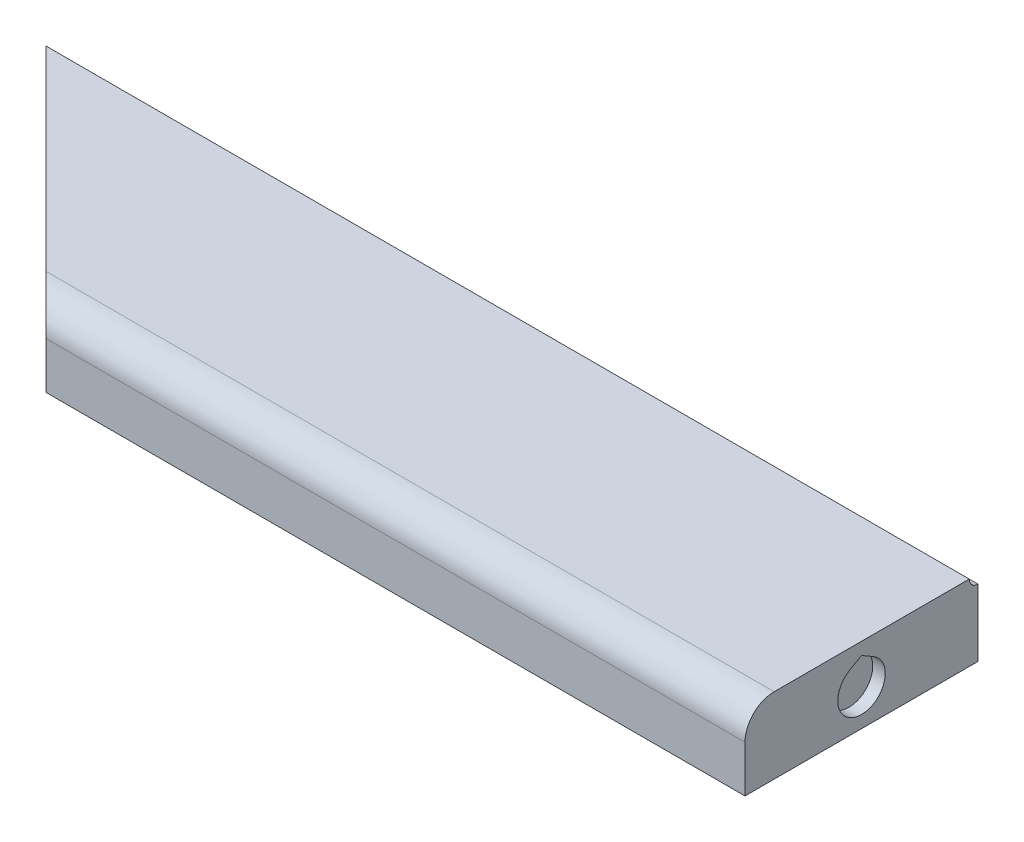
ISO-10303-21;
HEADER;
FILE_DESCRIPTION(('STEP AP214'),'2;1');
FILE_NAME('part.step','',(''),(''),'','','');
FILE_SCHEMA(('AUTOMOTIVE_DESIGN { 1 0 10303 214 1 1 1 1 }'));
ENDSEC;
DATA;
#1=APPLICATION_CONTEXT('core data for automotive mechanical design processes');
#2=APPLICATION_PROTOCOL_DEFINITION('international standard','automotive_design',2000,#1);
#3=PRODUCT_CONTEXT('',#1,'mechanical');
#4=PRODUCT('Part','Part','',(#3));
#5=PRODUCT_RELATED_PRODUCT_CATEGORY('part','',(#4));
#6=PRODUCT_DEFINITION_FORMATION('','',#4);
#7=PRODUCT_DEFINITION_CONTEXT('part definition',#1,'design');
#8=PRODUCT_DEFINITION('design','',#6,#7);
#9=PRODUCT_DEFINITION_SHAPE('','',#8);
#10=(LENGTH_UNIT() NAMED_UNIT(*) SI_UNIT(.MILLI.,.METRE.));
#11=(NAMED_UNIT(*) PLANE_ANGLE_UNIT() SI_UNIT($,.RADIAN.));
#12=(NAMED_UNIT(*) SI_UNIT($,.STERADIAN.) SOLID_ANGLE_UNIT());
#13=UNCERTAINTY_MEASURE_WITH_UNIT(LENGTH_MEASURE(1.E-05),#10,'distance_accuracy_value','');
#14=(GEOMETRIC_REPRESENTATION_CONTEXT(3) GLOBAL_UNCERTAINTY_ASSIGNED_CONTEXT((#13)) GLOBAL_UNIT_ASSIGNED_CONTEXT((#10,
#11,#12)) REPRESENTATION_CONTEXT('',''));
#15=CARTESIAN_POINT('',(0.,0.,0.));
#16=DIRECTION('',(0.,0.,1.));
#17=DIRECTION('',(1.,0.,0.));
#18=AXIS2_PLACEMENT_3D('',#15,#16,#17);
#19=CARTESIAN_POINT('',(80.,-13.,20.));
#20=DIRECTION('',(1.,0.,0.));
#21=DIRECTION('',(0.,0.,-1.));
#22=AXIS2_PLACEMENT_3D('',#19,#20,#21);
#23=PLANE('',#22);
#24=DIRECTION('',(0.,0.,-1.));
#25=VECTOR('',#24,1.);
#26=CARTESIAN_POINT('',(80.,0.,20.));
#27=LINE('',#26,#25);
#28=CARTESIAN_POINT('',(80.,0.,15.));
#29=VERTEX_POINT('',#28);
#30=CARTESIAN_POINT('',(80.,0.,-18.5));
#31=VERTEX_POINT('',#30);
#32=EDGE_CURVE('E232',#29,#31,#27,.T.);
#33=ORIENTED_EDGE('',*,*,#32,.F.);
#34=CARTESIAN_POINT('',(80.,-5.,15.));
#35=DIRECTION('',(1.,0.,0.));
#36=DIRECTION('',(0.,0.,-1.));
#37=AXIS2_PLACEMENT_3D('',#34,#35,#36);
#38=CIRCLE('',#37,5.);
#39=CARTESIAN_POINT('',(80.,-5.,20.));
#40=VERTEX_POINT('',#39);
#41=EDGE_CURVE('E260',#29,#40,#38,.T.);
#42=ORIENTED_EDGE('',*,*,#41,.T.);
#43=DIRECTION('',(0.,1.,0.));
#44=VECTOR('',#43,1.);
#45=CARTESIAN_POINT('',(80.,-13.,20.));
#46=LINE('',#45,#44);
#47=CARTESIAN_POINT('',(80.,-13.,20.));
#48=VERTEX_POINT('',#47);
#49=EDGE_CURVE('E252',#48,#40,#46,.T.);
#50=ORIENTED_EDGE('',*,*,#49,.F.);
#51=DIRECTION('',(0.,0.,-1.));
#52=VECTOR('',#51,1.);
#53=CARTESIAN_POINT('',(80.,-13.,20.));
#54=LINE('',#53,#52);
#55=CARTESIAN_POINT('',(80.,-13.,-20.));
#56=VERTEX_POINT('',#55);
#57=EDGE_CURVE('E235',#48,#56,#54,.T.);
#58=ORIENTED_EDGE('',*,*,#57,.T.);
#59=DIRECTION('',(0.,1.,0.));
#60=VECTOR('',#59,1.);
#61=CARTESIAN_POINT('',(80.,-13.,-20.));
#62=LINE('',#61,#60);
#63=CARTESIAN_POINT('',(80.,-1.5,-20.));
#64=VERTEX_POINT('',#63);
#65=EDGE_CURVE('E249',#56,#64,#62,.T.);
#66=ORIENTED_EDGE('',*,*,#65,.T.);
#67=CARTESIAN_POINT('',(80.,0.,-20.));
#68=DIRECTION('',(1.,0.,0.));
#69=DIRECTION('',(0.,0.,-1.));
#70=AXIS2_PLACEMENT_3D('',#67,#68,#69);
#71=CIRCLE('',#70,1.5);
#72=EDGE_CURVE('E193',#64,#31,#71,.F.);
#73=ORIENTED_EDGE('',*,*,#72,.T.);
#74=EDGE_LOOP('',(#33,#42,#50,#58,#66,#73));
#75=FACE_BOUND('',#74,.T.);
#76=DIRECTION('',(0.,-0.499999999999997,-0.866025403784441));
#77=VECTOR('',#76,1.);
#78=CARTESIAN_POINT('',(80.,-1.58234823978922,0.913569182193995));
#79=LINE('',#78,#77);
#80=CARTESIAN_POINT('',(80.,-2.10979765305228,0.));
#81=VERTEX_POINT('',#80);
#82=CARTESIAN_POINT('',(80.,-3.28614882652613,-2.03750000000002));
#83=VERTEX_POINT('',#82);
#84=EDGE_CURVE('E164',#81,#83,#79,.T.);
#85=ORIENTED_EDGE('',*,*,#84,.T.);
#86=CARTESIAN_POINT('',(80.,-6.81520234694772,0.));
#87=DIRECTION('',(1.,0.,0.));
#88=DIRECTION('',(0.,0.,-1.));
#89=AXIS2_PLACEMENT_3D('',#86,#87,#88);
#90=CIRCLE('',#89,4.075);
#91=CARTESIAN_POINT('',(80.,-3.28614882652612,2.03749999999996));
#92=VERTEX_POINT('',#91);
#93=EDGE_CURVE('E53',#83,#92,#90,.F.);
#94=ORIENTED_EDGE('',*,*,#93,.T.);
#95=DIRECTION('',(0.,-0.499999999999996,0.866025403784441));
#96=VECTOR('',#95,1.);
#97=CARTESIAN_POINT('',(80.,-1.58234823978922,-0.913569182194059));
#98=LINE('',#97,#96);
#99=EDGE_CURVE('E161',#81,#92,#98,.T.);
#100=ORIENTED_EDGE('',*,*,#99,.F.);
#101=EDGE_LOOP('',(#85,#94,#100));
#102=FACE_BOUND('',#101,.T.);
#103=ADVANCED_FACE('F38',(#75,#102),#23,.T.);
#104=CARTESIAN_POINT('',(-80.,-13.,-20.));
#105=DIRECTION('',(0.,0.,-1.));
#106=DIRECTION('',(-1.,0.,0.));
#107=AXIS2_PLACEMENT_3D('',#104,#105,#106);
#108=PLANE('',#107);
#109=CARTESIAN_POINT('',(40.,-7.56520234694772,-20.));
#110=DIRECTION('',(0.,0.,-1.));
#111=DIRECTION('',(-1.,0.,0.));
#112=AXIS2_PLACEMENT_3D('',#109,#110,#111);
#113=CIRCLE('',#112,4.075);
#114=CARTESIAN_POINT('',(42.0375,-4.03614882652612,-20.));
#115=VERTEX_POINT('',#114);
#116=CARTESIAN_POINT('',(37.9625,-4.03614882652615,-20.));
#117=VERTEX_POINT('',#116);
#118=EDGE_CURVE('E183',#115,#117,#113,.T.);
#119=ORIENTED_EDGE('',*,*,#118,.F.);
#120=DIRECTION('',(-0.866025403784441,0.499999999999996,0.));
#121=VECTOR('',#120,1.);
#122=CARTESIAN_POINT('',(8.76167129138664,15.1756598358994,-20.));
#123=LINE('',#122,#121);
#124=CARTESIAN_POINT('',(40.,-2.85979765305228,-20.));
#125=VERTEX_POINT('',#124);
#126=EDGE_CURVE('E178',#115,#125,#123,.T.);
#127=ORIENTED_EDGE('',*,*,#126,.T.);
#128=DIRECTION('',(-0.866025403784441,-0.499999999999996,0.));
#129=VECTOR('',#128,1.);
#130=CARTESIAN_POINT('',(11.238328708613,-19.4653563154779,-20.));
#131=LINE('',#130,#129);
#132=EDGE_CURVE('E185',#125,#117,#131,.T.);
#133=ORIENTED_EDGE('',*,*,#132,.T.);
#134=EDGE_LOOP('',(#119,#127,#133));
#135=FACE_BOUND('',#134,.T.);
#136=DIRECTION('',(-1.,0.,0.));
#137=VECTOR('',#136,1.);
#138=CARTESIAN_POINT('',(83.9999999999999,-1.5,-20.));
#139=LINE('',#138,#137);
#140=CARTESIAN_POINT('',(-80.,-1.5,-20.));
#141=VERTEX_POINT('',#140);
#142=EDGE_CURVE('E225',#64,#141,#139,.T.);
#143=ORIENTED_EDGE('',*,*,#142,.F.);
#144=ORIENTED_EDGE('',*,*,#65,.F.);
#145=DIRECTION('',(-1.,0.,0.));
#146=VECTOR('',#145,1.);
#147=CARTESIAN_POINT('',(-80.,-13.,-20.));
#148=LINE('',#147,#146);
#149=CARTESIAN_POINT('',(-80.,-13.,-20.));
#150=VERTEX_POINT('',#149);
#151=EDGE_CURVE('E238',#56,#150,#148,.T.);
#152=ORIENTED_EDGE('',*,*,#151,.T.);
#153=DIRECTION('',(0.,1.,0.));
#154=VECTOR('',#153,1.);
#155=CARTESIAN_POINT('',(-80.,-13.,-20.));
#156=LINE('',#155,#154);
#157=EDGE_CURVE('E245',#150,#141,#156,.T.);
#158=ORIENTED_EDGE('',*,*,#157,.T.);
#159=EDGE_LOOP('',(#143,#144,#152,#158));
#160=FACE_BOUND('',#159,.T.);
#161=DIRECTION('',(0.866025403784441,0.499999999999996,0.));
#162=VECTOR('',#161,1.);
#163=CARTESIAN_POINT('',(-8.76167129138664,15.1756598358995,-20.));
#164=LINE('',#163,#162);
#165=CARTESIAN_POINT('',(-42.0375,-4.03614882652612,-20.));
#166=VERTEX_POINT('',#165);
#167=CARTESIAN_POINT('',(-40.,-2.85979765305227,-20.));
#168=VERTEX_POINT('',#167);
#169=EDGE_CURVE('E210',#166,#168,#164,.T.);
#170=ORIENTED_EDGE('',*,*,#169,.F.);
#171=CARTESIAN_POINT('',(-40.,-7.56520234694772,-20.));
#172=DIRECTION('',(0.,0.,-1.));
#173=DIRECTION('',(-1.,0.,0.));
#174=AXIS2_PLACEMENT_3D('',#171,#172,#173);
#175=CIRCLE('',#174,4.075);
#176=CARTESIAN_POINT('',(-37.9625,-4.03614882652612,-20.));
#177=VERTEX_POINT('',#176);
#178=EDGE_CURVE('E172',#166,#177,#175,.F.);
#179=ORIENTED_EDGE('',*,*,#178,.T.);
#180=DIRECTION('',(0.866025403784441,-0.499999999999996,0.));
#181=VECTOR('',#180,1.);
#182=CARTESIAN_POINT('',(-11.238328708613,-19.4653563154779,-20.));
#183=LINE('',#182,#181);
#184=EDGE_CURVE('E201',#168,#177,#183,.T.);
#185=ORIENTED_EDGE('',*,*,#184,.F.);
#186=EDGE_LOOP('',(#170,#179,#185));
#187=FACE_BOUND('',#186,.T.);
#188=ADVANCED_FACE('F281',(#135,#160,#187),#108,.T.);
#189=CARTESIAN_POINT('',(-39.9999999999996,-13.,20.));
#190=DIRECTION('',(-0.707106781186544,0.,0.707106781186552));
#191=DIRECTION('',(0.707106781186551,0.,0.707106781186544));
#192=AXIS2_PLACEMENT_3D('',#189,#190,#191);
#193=PLANE('',#192);
#194=DIRECTION('',(0.,1.,0.));
#195=VECTOR('',#194,1.);
#196=CARTESIAN_POINT('',(-39.9999999999996,-13.,20.));
#197=LINE('',#196,#195);
#198=CARTESIAN_POINT('',(-39.9999999999996,-13.,20.));
#199=VERTEX_POINT('',#198);
#200=CARTESIAN_POINT('',(-39.9999999999996,-5.,20.));
#201=VERTEX_POINT('',#200);
#202=EDGE_CURVE('E241',#199,#201,#197,.T.);
#203=ORIENTED_EDGE('',*,*,#202,.T.);
#204=CARTESIAN_POINT('',(-44.9999999999996,-5.,15.));
#205=DIRECTION('',(-0.707106781186544,0.,0.707106781186552));
#206=DIRECTION('',(-0.707106781186551,0.,-0.707106781186544));
#207=AXIS2_PLACEMENT_3D('',#204,#205,#206);
#208=ELLIPSE('',#207,7.07106781186551,5.);
#209=CARTESIAN_POINT('',(-44.9999999999996,0.,15.));
#210=VERTEX_POINT('',#209);
#211=EDGE_CURVE('E11',#201,#210,#208,.T.);
#212=ORIENTED_EDGE('',*,*,#211,.T.);
#213=DIRECTION('',(0.707106781186551,0.,0.707106781186544));
#214=VECTOR('',#213,1.);
#215=CARTESIAN_POINT('',(-39.9999999999996,0.,20.));
#216=LINE('',#215,#214);
#217=CARTESIAN_POINT('',(-78.5,0.,-18.5));
#218=VERTEX_POINT('',#217);
#219=EDGE_CURVE('E227',#218,#210,#216,.T.);
#220=ORIENTED_EDGE('',*,*,#219,.F.);
#221=CARTESIAN_POINT('',(-80.,0.,-20.));
#222=DIRECTION('',(-0.707106781186544,0.,0.707106781186552));
#223=DIRECTION('',(-0.707106781186551,0.,-0.707106781186544));
#224=AXIS2_PLACEMENT_3D('',#221,#222,#223);
#225=ELLIPSE('',#224,2.12132034355966,1.5);
#226=EDGE_CURVE('E222',#218,#141,#225,.F.);
#227=ORIENTED_EDGE('',*,*,#226,.T.);
#228=ORIENTED_EDGE('',*,*,#157,.F.);
#229=DIRECTION('',(0.707106781186551,0.,0.707106781186544));
#230=VECTOR('',#229,1.);
#231=CARTESIAN_POINT('',(-39.9999999999996,-13.,20.));
#232=LINE('',#231,#230);
#233=EDGE_CURVE('E228',#150,#199,#232,.T.);
#234=ORIENTED_EDGE('',*,*,#233,.T.);
#235=EDGE_LOOP('',(#203,#212,#220,#227,#228,#234));
#236=FACE_BOUND('',#235,.T.);
#237=ADVANCED_FACE('F272',(#236),#193,.T.);
#238=CARTESIAN_POINT('',(-39.9999999999996,-13.,20.));
#239=DIRECTION('',(0.,0.,1.));
#240=DIRECTION('',(1.,0.,0.));
#241=AXIS2_PLACEMENT_3D('',#238,#239,#240);
#242=PLANE('',#241);
#243=ORIENTED_EDGE('',*,*,#49,.T.);
#244=DIRECTION('',(1.,0.,0.));
#245=VECTOR('',#244,1.);
#246=CARTESIAN_POINT('',(-39.9999999999996,-5.,20.));
#247=LINE('',#246,#245);
#248=EDGE_CURVE('E46',#40,#201,#247,.F.);
#249=ORIENTED_EDGE('',*,*,#248,.T.);
#250=ORIENTED_EDGE('',*,*,#202,.F.);
#251=DIRECTION('',(1.,0.,0.));
#252=VECTOR('',#251,1.);
#253=CARTESIAN_POINT('',(-39.9999999999996,-13.,20.));
#254=LINE('',#253,#252);
#255=EDGE_CURVE('E231',#199,#48,#254,.T.);
#256=ORIENTED_EDGE('',*,*,#255,.T.);
#257=EDGE_LOOP('',(#243,#249,#250,#256));
#258=FACE_BOUND('',#257,.T.);
#259=ADVANCED_FACE('F267',(#258),#242,.T.);
#260=CARTESIAN_POINT('',(0.,-13.,0.));
#261=DIRECTION('',(0.,-1.,0.));
#262=DIRECTION('',(0.,0.,-1.));
#263=AXIS2_PLACEMENT_3D('',#260,#261,#262);
#264=PLANE('',#263);
#265=ORIENTED_EDGE('',*,*,#233,.F.);
#266=ORIENTED_EDGE('',*,*,#151,.F.);
#267=ORIENTED_EDGE('',*,*,#57,.F.);
#268=ORIENTED_EDGE('',*,*,#255,.F.);
#269=EDGE_LOOP('',(#265,#266,#267,#268));
#270=FACE_BOUND('',#269,.T.);
#271=ADVANCED_FACE('F285',(#270),#264,.T.);
#272=CARTESIAN_POINT('',(0.,0.,0.));
#273=DIRECTION('',(0.,-1.,0.));
#274=DIRECTION('',(0.,0.,-1.));
#275=AXIS2_PLACEMENT_3D('',#272,#273,#274);
#276=PLANE('',#275);
#277=ORIENTED_EDGE('',*,*,#219,.T.);
#278=DIRECTION('',(1.,0.,0.));
#279=VECTOR('',#278,1.);
#280=CARTESIAN_POINT('',(80.,0.,15.));
#281=LINE('',#280,#279);
#282=EDGE_CURVE('E257',#210,#29,#281,.T.);
#283=ORIENTED_EDGE('',*,*,#282,.T.);
#284=ORIENTED_EDGE('',*,*,#32,.T.);
#285=DIRECTION('',(-1.,0.,0.));
#286=VECTOR('',#285,1.);
#287=CARTESIAN_POINT('',(83.9999999999999,0.,-18.5));
#288=LINE('',#287,#286);
#289=EDGE_CURVE('E248',#31,#218,#288,.T.);
#290=ORIENTED_EDGE('',*,*,#289,.T.);
#291=EDGE_LOOP('',(#277,#283,#284,#290));
#292=FACE_BOUND('',#291,.T.);
#293=ADVANCED_FACE('F274',(#292),#276,.F.);
#294=CARTESIAN_POINT('',(83.9999999999999,0.,-20.));
#295=DIRECTION('',(-1.,0.,0.));
#296=DIRECTION('',(0.,0.,1.));
#297=AXIS2_PLACEMENT_3D('',#294,#295,#296);
#298=CYLINDRICAL_SURFACE('',#297,1.5);
#299=ORIENTED_EDGE('',*,*,#142,.T.);
#300=ORIENTED_EDGE('',*,*,#226,.F.);
#301=ORIENTED_EDGE('',*,*,#289,.F.);
#302=ORIENTED_EDGE('',*,*,#72,.F.);
#303=EDGE_LOOP('',(#299,#300,#301,#302));
#304=FACE_BOUND('',#303,.T.);
#305=ADVANCED_FACE('F277',(#304),#298,.F.);
#306=CARTESIAN_POINT('',(-40.,-7.56520234694772,-17.85));
#307=DIRECTION('',(0.,0.,-1.));
#308=DIRECTION('',(-1.,0.,0.));
#309=AXIS2_PLACEMENT_3D('',#306,#307,#308);
#310=CYLINDRICAL_SURFACE('',#309,4.075);
#311=ORIENTED_EDGE('',*,*,#178,.F.);
#312=DIRECTION('',(0.,0.,-1.));
#313=VECTOR('',#312,1.);
#314=CARTESIAN_POINT('',(-42.0375,-4.03614882652611,-17.85));
#315=LINE('',#314,#313);
#316=CARTESIAN_POINT('',(-42.0375,-4.03614882652611,-17.85));
#317=VERTEX_POINT('',#316);
#318=EDGE_CURVE('E207',#317,#166,#315,.T.);
#319=ORIENTED_EDGE('',*,*,#318,.F.);
#320=CARTESIAN_POINT('',(-40.,-7.56520234694772,-17.85));
#321=DIRECTION('',(0.,0.,-1.));
#322=DIRECTION('',(-1.,0.,0.));
#323=AXIS2_PLACEMENT_3D('',#320,#321,#322);
#324=CIRCLE('',#323,4.075);
#325=CARTESIAN_POINT('',(-37.9625,-4.03614882652612,-17.85));
#326=VERTEX_POINT('',#325);
#327=EDGE_CURVE('E198',#317,#326,#324,.F.);
#328=ORIENTED_EDGE('',*,*,#327,.T.);
#329=DIRECTION('',(0.,0.,-1.));
#330=VECTOR('',#329,1.);
#331=CARTESIAN_POINT('',(-37.9625,-4.03614882652612,-17.85));
#332=LINE('',#331,#330);
#333=EDGE_CURVE('E186',#326,#177,#332,.T.);
#334=ORIENTED_EDGE('',*,*,#333,.T.);
#335=EDGE_LOOP('',(#311,#319,#328,#334));
#336=FACE_BOUND('',#335,.T.);
#337=ADVANCED_FACE('F453',(#336),#310,.F.);
#338=CARTESIAN_POINT('',(-11.238328708613,-19.4653563154779,-17.85));
#339=DIRECTION('',(0.499999999999996,0.86602540378444,0.));
#340=DIRECTION('',(-0.866025403784441,0.499999999999997,0.));
#341=AXIS2_PLACEMENT_3D('',#338,#339,#340);
#342=PLANE('',#341);
#343=ORIENTED_EDGE('',*,*,#184,.T.);
#344=ORIENTED_EDGE('',*,*,#333,.F.);
#345=DIRECTION('',(0.866025403784441,-0.499999999999996,0.));
#346=VECTOR('',#345,1.);
#347=CARTESIAN_POINT('',(-11.238328708613,-19.4653563154779,-17.85));
#348=LINE('',#347,#346);
#349=CARTESIAN_POINT('',(-40.,-2.85979765305227,-17.85));
#350=VERTEX_POINT('',#349);
#351=EDGE_CURVE('E204',#350,#326,#348,.T.);
#352=ORIENTED_EDGE('',*,*,#351,.F.);
#353=DIRECTION('',(0.,0.,-1.));
#354=VECTOR('',#353,1.);
#355=CARTESIAN_POINT('',(-40.,-2.85979765305227,-17.85));
#356=LINE('',#355,#354);
#357=EDGE_CURVE('E216',#350,#168,#356,.T.);
#358=ORIENTED_EDGE('',*,*,#357,.T.);
#359=EDGE_LOOP('',(#343,#344,#352,#358));
#360=FACE_BOUND('',#359,.T.);
#361=ADVANCED_FACE('F443',(#360),#342,.F.);
#362=CARTESIAN_POINT('',(-8.76167129138664,15.1756598358995,-17.85));
#363=DIRECTION('',(-0.499999999999996,0.866025403784441,0.));
#364=DIRECTION('',(-0.866025403784441,-0.499999999999996,0.));
#365=AXIS2_PLACEMENT_3D('',#362,#363,#364);
#366=PLANE('',#365);
#367=ORIENTED_EDGE('',*,*,#169,.T.);
#368=ORIENTED_EDGE('',*,*,#357,.F.);
#369=DIRECTION('',(0.866025403784441,0.499999999999996,0.));
#370=VECTOR('',#369,1.);
#371=CARTESIAN_POINT('',(-8.76167129138664,15.1756598358995,-17.85));
#372=LINE('',#371,#370);
#373=EDGE_CURVE('E200',#317,#350,#372,.T.);
#374=ORIENTED_EDGE('',*,*,#373,.F.);
#375=ORIENTED_EDGE('',*,*,#318,.T.);
#376=EDGE_LOOP('',(#367,#368,#374,#375));
#377=FACE_BOUND('',#376,.T.);
#378=ADVANCED_FACE('F434',(#377),#366,.F.);
#379=CARTESIAN_POINT('',(0.,0.,-17.85));
#380=DIRECTION('',(0.,0.,-1.));
#381=DIRECTION('',(-1.,0.,0.));
#382=AXIS2_PLACEMENT_3D('',#379,#380,#381);
#383=PLANE('',#382);
#384=ORIENTED_EDGE('',*,*,#327,.F.);
#385=ORIENTED_EDGE('',*,*,#373,.T.);
#386=ORIENTED_EDGE('',*,*,#351,.T.);
#387=EDGE_LOOP('',(#384,#385,#386));
#388=FACE_BOUND('',#387,.T.);
#389=ADVANCED_FACE('F423',(#388),#383,.T.);
#390=CARTESIAN_POINT('',(40.,-7.56520234694772,-17.85));
#391=DIRECTION('',(0.,0.,-1.));
#392=DIRECTION('',(-1.,0.,0.));
#393=AXIS2_PLACEMENT_3D('',#390,#391,#392);
#394=CYLINDRICAL_SURFACE('',#393,4.075);
#395=ORIENTED_EDGE('',*,*,#118,.T.);
#396=DIRECTION('',(0.,0.,-1.));
#397=VECTOR('',#396,1.);
#398=CARTESIAN_POINT('',(37.9625,-4.03614882652613,-17.85));
#399=LINE('',#398,#397);
#400=CARTESIAN_POINT('',(37.9625,-4.03614882652613,-17.85));
#401=VERTEX_POINT('',#400);
#402=EDGE_CURVE('E182',#401,#117,#399,.T.);
#403=ORIENTED_EDGE('',*,*,#402,.F.);
#404=CARTESIAN_POINT('',(40.,-7.56520234694772,-17.85));
#405=DIRECTION('',(0.,0.,-1.));
#406=DIRECTION('',(-1.,0.,0.));
#407=AXIS2_PLACEMENT_3D('',#404,#405,#406);
#408=CIRCLE('',#407,4.075);
#409=CARTESIAN_POINT('',(42.0375,-4.03614882652612,-17.85));
#410=VERTEX_POINT('',#409);
#411=EDGE_CURVE('E174',#410,#401,#408,.T.);
#412=ORIENTED_EDGE('',*,*,#411,.F.);
#413=DIRECTION('',(0.,0.,-1.));
#414=VECTOR('',#413,1.);
#415=CARTESIAN_POINT('',(42.0375,-4.03614882652612,-17.85));
#416=LINE('',#415,#414);
#417=EDGE_CURVE('E191',#410,#115,#416,.T.);
#418=ORIENTED_EDGE('',*,*,#417,.T.);
#419=EDGE_LOOP('',(#395,#403,#412,#418));
#420=FACE_BOUND('',#419,.T.);
#421=ADVANCED_FACE('F413',(#420),#394,.F.);
#422=CARTESIAN_POINT('',(8.76167129138664,15.1756598358994,-17.85));
#423=DIRECTION('',(-0.499999999999996,-0.866025403784441,0.));
#424=DIRECTION('',(0.866025403784441,-0.499999999999996,0.));
#425=AXIS2_PLACEMENT_3D('',#422,#423,#424);
#426=PLANE('',#425);
#427=ORIENTED_EDGE('',*,*,#126,.F.);
#428=ORIENTED_EDGE('',*,*,#417,.F.);
#429=DIRECTION('',(-0.866025403784441,0.499999999999996,0.));
#430=VECTOR('',#429,1.);
#431=CARTESIAN_POINT('',(8.76167129138664,15.1756598358994,-17.85));
#432=LINE('',#431,#430);
#433=CARTESIAN_POINT('',(40.,-2.85979765305228,-17.85));
#434=VERTEX_POINT('',#433);
#435=EDGE_CURVE('E180',#410,#434,#432,.T.);
#436=ORIENTED_EDGE('',*,*,#435,.T.);
#437=DIRECTION('',(0.,0.,-1.));
#438=VECTOR('',#437,1.);
#439=CARTESIAN_POINT('',(40.,-2.85979765305228,-17.85));
#440=LINE('',#439,#438);
#441=EDGE_CURVE('E194',#434,#125,#440,.T.);
#442=ORIENTED_EDGE('',*,*,#441,.T.);
#443=EDGE_LOOP('',(#427,#428,#436,#442));
#444=FACE_BOUND('',#443,.T.);
#445=ADVANCED_FACE('F403',(#444),#426,.T.);
#446=CARTESIAN_POINT('',(11.238328708613,-19.4653563154779,-17.85));
#447=DIRECTION('',(0.499999999999996,-0.86602540378444,0.));
#448=DIRECTION('',(0.866025403784441,0.499999999999997,0.));
#449=AXIS2_PLACEMENT_3D('',#446,#447,#448);
#450=PLANE('',#449);
#451=ORIENTED_EDGE('',*,*,#132,.F.);
#452=ORIENTED_EDGE('',*,*,#441,.F.);
#453=DIRECTION('',(-0.866025403784441,-0.499999999999996,0.));
#454=VECTOR('',#453,1.);
#455=CARTESIAN_POINT('',(11.238328708613,-19.4653563154779,-17.85));
#456=LINE('',#455,#454);
#457=EDGE_CURVE('E177',#434,#401,#456,.T.);
#458=ORIENTED_EDGE('',*,*,#457,.T.);
#459=ORIENTED_EDGE('',*,*,#402,.T.);
#460=EDGE_LOOP('',(#451,#452,#458,#459));
#461=FACE_BOUND('',#460,.T.);
#462=ADVANCED_FACE('F394',(#461),#450,.T.);
#463=CARTESIAN_POINT('',(0.,0.,-17.85));
#464=DIRECTION('',(0.,0.,-1.));
#465=DIRECTION('',(-1.,0.,0.));
#466=AXIS2_PLACEMENT_3D('',#463,#464,#465);
#467=PLANE('',#466);
#468=ORIENTED_EDGE('',*,*,#411,.T.);
#469=ORIENTED_EDGE('',*,*,#457,.F.);
#470=ORIENTED_EDGE('',*,*,#435,.F.);
#471=EDGE_LOOP('',(#468,#469,#470));
#472=FACE_BOUND('',#471,.T.);
#473=ADVANCED_FACE('F331',(#472),#467,.T.);
#474=CARTESIAN_POINT('',(0.,-5.,15.));
#475=DIRECTION('',(-1.,0.,0.));
#476=DIRECTION('',(0.,0.,1.));
#477=AXIS2_PLACEMENT_3D('',#474,#475,#476);
#478=CYLINDRICAL_SURFACE('',#477,5.);
#479=ORIENTED_EDGE('',*,*,#211,.F.);
#480=ORIENTED_EDGE('',*,*,#248,.F.);
#481=ORIENTED_EDGE('',*,*,#41,.F.);
#482=ORIENTED_EDGE('',*,*,#282,.F.);
#483=EDGE_LOOP('',(#479,#480,#481,#482));
#484=FACE_BOUND('',#483,.T.);
#485=ADVANCED_FACE('F40',(#484),#478,.T.);
#486=CARTESIAN_POINT('',(77.85,-6.81520234694772,0.));
#487=DIRECTION('',(1.,0.,0.));
#488=DIRECTION('',(0.,0.,-1.));
#489=AXIS2_PLACEMENT_3D('',#486,#487,#488);
#490=CYLINDRICAL_SURFACE('',#489,4.075);
#491=ORIENTED_EDGE('',*,*,#93,.F.);
#492=DIRECTION('',(1.,0.,0.));
#493=VECTOR('',#492,1.);
#494=CARTESIAN_POINT('',(77.85,-3.28614882652613,-2.03750000000002));
#495=LINE('',#494,#493);
#496=CARTESIAN_POINT('',(77.85,-3.28614882652613,-2.03750000000002));
#497=VERTEX_POINT('',#496);
#498=EDGE_CURVE('E147',#497,#83,#495,.T.);
#499=ORIENTED_EDGE('',*,*,#498,.F.);
#500=CARTESIAN_POINT('',(77.85,-6.81520234694772,0.));
#501=DIRECTION('',(1.,0.,0.));
#502=DIRECTION('',(0.,0.,-1.));
#503=AXIS2_PLACEMENT_3D('',#500,#501,#502);
#504=CIRCLE('',#503,4.075);
#505=CARTESIAN_POINT('',(77.85,-3.28614882652612,2.03749999999996));
#506=VERTEX_POINT('',#505);
#507=EDGE_CURVE('E155',#497,#506,#504,.F.);
#508=ORIENTED_EDGE('',*,*,#507,.T.);
#509=DIRECTION('',(1.,0.,0.));
#510=VECTOR('',#509,1.);
#511=CARTESIAN_POINT('',(77.85,-3.28614882652612,2.03749999999996));
#512=LINE('',#511,#510);
#513=EDGE_CURVE('E170',#506,#92,#512,.T.);
#514=ORIENTED_EDGE('',*,*,#513,.T.);
#515=EDGE_LOOP('',(#491,#499,#508,#514));
#516=FACE_BOUND('',#515,.T.);
#517=ADVANCED_FACE('F157',(#516),#490,.F.);
#518=CARTESIAN_POINT('',(77.85,-1.58234823978922,-0.913569182194059));
#519=DIRECTION('',(0.,0.866025403784441,0.499999999999996));
#520=DIRECTION('',(0.,-0.499999999999996,0.866025403784441));
#521=AXIS2_PLACEMENT_3D('',#518,#519,#520);
#522=PLANE('',#521);
#523=ORIENTED_EDGE('',*,*,#99,.T.);
#524=ORIENTED_EDGE('',*,*,#513,.F.);
#525=DIRECTION('',(0.,-0.499999999999996,0.866025403784441));
#526=VECTOR('',#525,1.);
#527=CARTESIAN_POINT('',(77.85,-1.58234823978922,-0.913569182194059));
#528=LINE('',#527,#526);
#529=CARTESIAN_POINT('',(77.85,-2.10979765305228,0.));
#530=VERTEX_POINT('',#529);
#531=EDGE_CURVE('E154',#530,#506,#528,.T.);
#532=ORIENTED_EDGE('',*,*,#531,.F.);
#533=DIRECTION('',(1.,0.,0.));
#534=VECTOR('',#533,1.);
#535=CARTESIAN_POINT('',(77.85,-2.10979765305228,0.));
#536=LINE('',#535,#534);
#537=EDGE_CURVE('E149',#530,#81,#536,.T.);
#538=ORIENTED_EDGE('',*,*,#537,.T.);
#539=EDGE_LOOP('',(#523,#524,#532,#538));
#540=FACE_BOUND('',#539,.T.);
#541=ADVANCED_FACE('F348',(#540),#522,.F.);
#542=CARTESIAN_POINT('',(77.85,-1.58234823978922,0.913569182193995));
#543=DIRECTION('',(0.,-0.86602540378444,0.499999999999997));
#544=DIRECTION('',(0.,-0.499999999999997,-0.86602540378444));
#545=AXIS2_PLACEMENT_3D('',#542,#543,#544);
#546=PLANE('',#545);
#547=ORIENTED_EDGE('',*,*,#84,.F.);
#548=ORIENTED_EDGE('',*,*,#537,.F.);
#549=DIRECTION('',(0.,-0.499999999999997,-0.866025403784441));
#550=VECTOR('',#549,1.);
#551=CARTESIAN_POINT('',(77.85,-1.58234823978922,0.913569182193995));
#552=LINE('',#551,#550);
#553=EDGE_CURVE('E144',#530,#497,#552,.T.);
#554=ORIENTED_EDGE('',*,*,#553,.T.);
#555=ORIENTED_EDGE('',*,*,#498,.T.);
#556=EDGE_LOOP('',(#547,#548,#554,#555));
#557=FACE_BOUND('',#556,.T.);
#558=ADVANCED_FACE('F146',(#557),#546,.T.);
#559=CARTESIAN_POINT('',(77.85,0.,0.));
#560=DIRECTION('',(1.,0.,0.));
#561=DIRECTION('',(0.,0.,-1.));
#562=AXIS2_PLACEMENT_3D('',#559,#560,#561);
#563=PLANE('',#562);
#564=ORIENTED_EDGE('',*,*,#507,.F.);
#565=ORIENTED_EDGE('',*,*,#553,.F.);
#566=ORIENTED_EDGE('',*,*,#531,.T.);
#567=EDGE_LOOP('',(#564,#565,#566));
#568=FACE_BOUND('',#567,.T.);
#569=ADVANCED_FACE('F160',(#568),#563,.T.);
#570=CLOSED_SHELL('',(#103,#188,#237,#259,#271,#293,#305,#337,#361,#378,#389,#421,#445,#462,
#473,#485,#517,#541,#558,#569));
#571=MANIFOLD_SOLID_BREP('B2',#570);
#572=ADVANCED_BREP_SHAPE_REPRESENTATION('',(#18,#571),#14);
#573=SHAPE_DEFINITION_REPRESENTATION(#9,#572);
ENDSEC;
END-ISO-10303-21;
